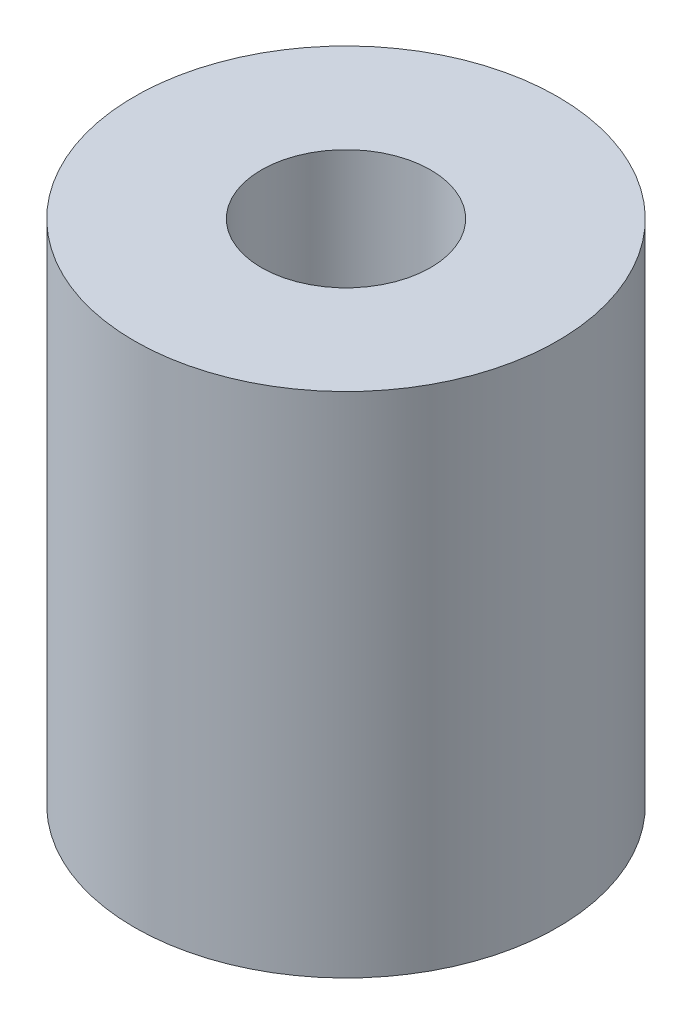
ISO-10303-21;
HEADER;
FILE_DESCRIPTION(('STEP AP214'),'2;1');
FILE_NAME('part.step','',(''),(''),'','','');
FILE_SCHEMA(('AUTOMOTIVE_DESIGN { 1 0 10303 214 1 1 1 1 }'));
ENDSEC;
DATA;
#1=APPLICATION_CONTEXT('core data for automotive mechanical design processes');
#2=APPLICATION_PROTOCOL_DEFINITION('international standard','automotive_design',2000,#1);
#3=PRODUCT_CONTEXT('',#1,'mechanical');
#4=PRODUCT('Part','Part','',(#3));
#5=PRODUCT_RELATED_PRODUCT_CATEGORY('part','',(#4));
#6=PRODUCT_DEFINITION_FORMATION('','',#4);
#7=PRODUCT_DEFINITION_CONTEXT('part definition',#1,'design');
#8=PRODUCT_DEFINITION('design','',#6,#7);
#9=PRODUCT_DEFINITION_SHAPE('','',#8);
#10=(LENGTH_UNIT() NAMED_UNIT(*) SI_UNIT(.MILLI.,.METRE.));
#11=(NAMED_UNIT(*) PLANE_ANGLE_UNIT() SI_UNIT($,.RADIAN.));
#12=(NAMED_UNIT(*) SI_UNIT($,.STERADIAN.) SOLID_ANGLE_UNIT());
#13=UNCERTAINTY_MEASURE_WITH_UNIT(LENGTH_MEASURE(1.E-05),#10,'distance_accuracy_value','');
#14=(GEOMETRIC_REPRESENTATION_CONTEXT(3) GLOBAL_UNCERTAINTY_ASSIGNED_CONTEXT((#13)) GLOBAL_UNIT_ASSIGNED_CONTEXT((#10,
#11,#12)) REPRESENTATION_CONTEXT('',''));
#15=CARTESIAN_POINT('',(0.,0.,0.));
#16=DIRECTION('',(0.,0.,1.));
#17=DIRECTION('',(1.,0.,0.));
#18=AXIS2_PLACEMENT_3D('',#15,#16,#17);
#19=CARTESIAN_POINT('',(0.,6.,0.));
#20=DIRECTION('',(0.,1.,0.));
#21=DIRECTION('',(0.,0.,1.));
#22=AXIS2_PLACEMENT_3D('',#19,#20,#21);
#23=PLANE('',#22);
#24=CARTESIAN_POINT('',(0.,6.,0.));
#25=DIRECTION('',(0.,1.,0.));
#26=DIRECTION('',(0.,0.,1.));
#27=AXIS2_PLACEMENT_3D('',#24,#25,#26);
#28=CIRCLE('',#27,2.5);
#29=CARTESIAN_POINT('',(0.,6.,2.5));
#30=VERTEX_POINT('',#29);
#31=EDGE_CURVE('E10',#30,#30,#28,.T.);
#32=ORIENTED_EDGE('',*,*,#31,.T.);
#33=EDGE_LOOP('',(#32));
#34=FACE_BOUND('',#33,.T.);
#35=CARTESIAN_POINT('',(0.,6.,0.));
#36=DIRECTION('',(0.,1.,0.));
#37=DIRECTION('',(0.,0.,1.));
#38=AXIS2_PLACEMENT_3D('',#35,#36,#37);
#39=CIRCLE('',#38,1.);
#40=CARTESIAN_POINT('',(0.,6.,1.));
#41=VERTEX_POINT('',#40);
#42=EDGE_CURVE('E43',#41,#41,#39,.T.);
#43=ORIENTED_EDGE('',*,*,#42,.F.);
#44=EDGE_LOOP('',(#43));
#45=FACE_BOUND('',#44,.T.);
#46=ADVANCED_FACE('F32',(#34,#45),#23,.T.);
#47=CARTESIAN_POINT('',(0.,0.,0.));
#48=DIRECTION('',(0.,1.,0.));
#49=DIRECTION('',(0.,0.,1.));
#50=AXIS2_PLACEMENT_3D('',#47,#48,#49);
#51=PLANE('',#50);
#52=CARTESIAN_POINT('',(0.,0.,0.));
#53=DIRECTION('',(0.,1.,0.));
#54=DIRECTION('',(0.,0.,1.));
#55=AXIS2_PLACEMENT_3D('',#52,#53,#54);
#56=CIRCLE('',#55,2.5);
#57=CARTESIAN_POINT('',(0.,0.,2.5));
#58=VERTEX_POINT('',#57);
#59=EDGE_CURVE('E36',#58,#58,#56,.T.);
#60=ORIENTED_EDGE('',*,*,#59,.F.);
#61=EDGE_LOOP('',(#60));
#62=FACE_BOUND('',#61,.T.);
#63=CARTESIAN_POINT('',(0.,0.,0.));
#64=DIRECTION('',(0.,1.,0.));
#65=DIRECTION('',(0.,0.,1.));
#66=AXIS2_PLACEMENT_3D('',#63,#64,#65);
#67=CIRCLE('',#66,1.);
#68=CARTESIAN_POINT('',(0.,0.,1.));
#69=VERTEX_POINT('',#68);
#70=EDGE_CURVE('E45',#69,#69,#67,.T.);
#71=ORIENTED_EDGE('',*,*,#70,.T.);
#72=EDGE_LOOP('',(#71));
#73=FACE_BOUND('',#72,.T.);
#74=ADVANCED_FACE('F55',(#62,#73),#51,.F.);
#75=CARTESIAN_POINT('',(0.,6.,0.));
#76=DIRECTION('',(0.,-1.,0.));
#77=DIRECTION('',(0.,0.,-1.));
#78=AXIS2_PLACEMENT_3D('',#75,#76,#77);
#79=CYLINDRICAL_SURFACE('',#78,2.5);
#80=ORIENTED_EDGE('',*,*,#31,.F.);
#81=EDGE_LOOP('',(#80));
#82=FACE_BOUND('',#81,.T.);
#83=ORIENTED_EDGE('',*,*,#59,.T.);
#84=EDGE_LOOP('',(#83));
#85=FACE_BOUND('',#84,.T.);
#86=ADVANCED_FACE('F34',(#82,#85),#79,.T.);
#87=CARTESIAN_POINT('',(0.,6.,0.));
#88=DIRECTION('',(0.,-1.,0.));
#89=DIRECTION('',(0.,0.,-1.));
#90=AXIS2_PLACEMENT_3D('',#87,#88,#89);
#91=CYLINDRICAL_SURFACE('',#90,1.);
#92=ORIENTED_EDGE('',*,*,#42,.T.);
#93=EDGE_LOOP('',(#92));
#94=FACE_BOUND('',#93,.T.);
#95=ORIENTED_EDGE('',*,*,#70,.F.);
#96=EDGE_LOOP('',(#95));
#97=FACE_BOUND('',#96,.T.);
#98=ADVANCED_FACE('F51',(#94,#97),#91,.F.);
#99=CLOSED_SHELL('',(#46,#74,#86,#98));
#100=MANIFOLD_SOLID_BREP('B2',#99);
#101=ADVANCED_BREP_SHAPE_REPRESENTATION('',(#18,#100),#14);
#102=SHAPE_DEFINITION_REPRESENTATION(#9,#101);
ENDSEC;
END-ISO-10303-21;
